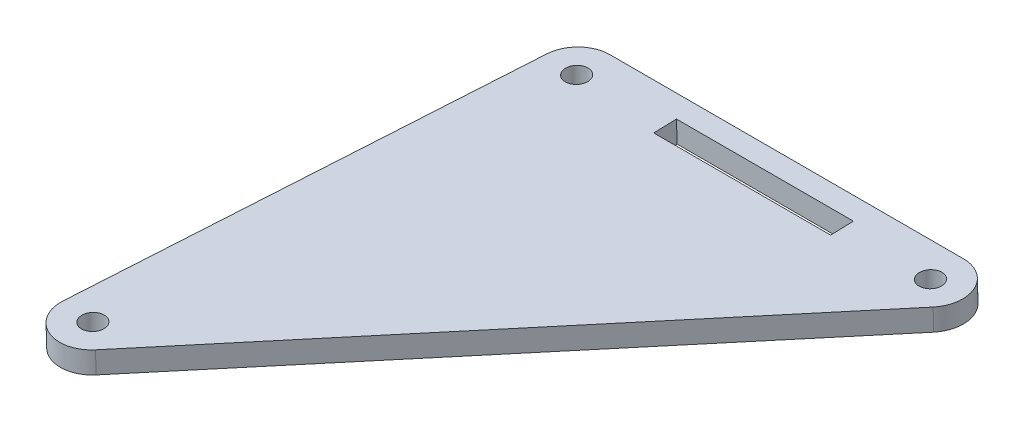
ISO-10303-21;
HEADER;
FILE_DESCRIPTION(('STEP AP214'),'2;1');
FILE_NAME('part.step','',(''),(''),'','','');
FILE_SCHEMA(('AUTOMOTIVE_DESIGN { 1 0 10303 214 1 1 1 1 }'));
ENDSEC;
DATA;
#1=APPLICATION_CONTEXT('core data for automotive mechanical design processes');
#2=APPLICATION_PROTOCOL_DEFINITION('international standard','automotive_design',2000,#1);
#3=PRODUCT_CONTEXT('',#1,'mechanical');
#4=PRODUCT('Part','Part','',(#3));
#5=PRODUCT_RELATED_PRODUCT_CATEGORY('part','',(#4));
#6=PRODUCT_DEFINITION_FORMATION('','',#4);
#7=PRODUCT_DEFINITION_CONTEXT('part definition',#1,'design');
#8=PRODUCT_DEFINITION('design','',#6,#7);
#9=PRODUCT_DEFINITION_SHAPE('','',#8);
#10=(LENGTH_UNIT() NAMED_UNIT(*) SI_UNIT(.MILLI.,.METRE.));
#11=(NAMED_UNIT(*) PLANE_ANGLE_UNIT() SI_UNIT($,.RADIAN.));
#12=(NAMED_UNIT(*) SI_UNIT($,.STERADIAN.) SOLID_ANGLE_UNIT());
#13=UNCERTAINTY_MEASURE_WITH_UNIT(LENGTH_MEASURE(1.E-05),#10,'distance_accuracy_value','');
#14=(GEOMETRIC_REPRESENTATION_CONTEXT(3) GLOBAL_UNCERTAINTY_ASSIGNED_CONTEXT((#13)) GLOBAL_UNIT_ASSIGNED_CONTEXT((#10,
#11,#12)) REPRESENTATION_CONTEXT('',''));
#15=CARTESIAN_POINT('',(0.,0.,0.));
#16=DIRECTION('',(0.,0.,1.));
#17=DIRECTION('',(1.,0.,0.));
#18=AXIS2_PLACEMENT_3D('',#15,#16,#17);
#19=CARTESIAN_POINT('',(-170.726579561146,368.882500273271,-539.625309413886));
#20=DIRECTION('',(0.,0.999518314669366,0.0310344750319807));
#21=DIRECTION('',(0.,-0.0310344750319807,0.999518314669366));
#22=AXIS2_PLACEMENT_3D('',#19,#20,#21);
#23=PLANE('',#22);
#24=DIRECTION('',(0.,-0.0310344750319856,0.999518314669366));
#25=VECTOR('',#24,1.);
#26=CARTESIAN_POINT('',(-246.926579561146,368.983793696328,-542.887637241135));
#27=LINE('',#26,#25);
#28=CARTESIAN_POINT('',(-246.926579561146,368.983793696328,-542.887637241135));
#29=VERTEX_POINT('',#28);
#30=CARTESIAN_POINT('',(-246.926579561146,368.781206850214,-536.362981586637));
#31=VERTEX_POINT('',#30);
#32=EDGE_CURVE('E54',#29,#31,#27,.T.);
#33=ORIENTED_EDGE('',*,*,#32,.F.);
#34=DIRECTION('',(-1.,0.,0.));
#35=VECTOR('',#34,1.);
#36=CARTESIAN_POINT('',(-246.926579561146,368.983793696328,-542.887637241135));
#37=LINE('',#36,#35);
#38=CARTESIAN_POINT('',(-196.126579561146,368.983793696328,-542.887637241135));
#39=VERTEX_POINT('',#38);
#40=EDGE_CURVE('E134',#39,#29,#37,.T.);
#41=ORIENTED_EDGE('',*,*,#40,.F.);
#42=DIRECTION('',(0.,0.0310344750319771,-0.999518314669366));
#43=VECTOR('',#42,1.);
#44=CARTESIAN_POINT('',(-196.126579561146,368.983793696328,-542.887637241135));
#45=LINE('',#44,#43);
#46=CARTESIAN_POINT('',(-196.126579561146,368.781206850214,-536.362981586637));
#47=VERTEX_POINT('',#46);
#48=EDGE_CURVE('E119',#47,#39,#45,.T.);
#49=ORIENTED_EDGE('',*,*,#48,.F.);
#50=DIRECTION('',(1.,0.,0.));
#51=VECTOR('',#50,1.);
#52=CARTESIAN_POINT('',(-246.926579561146,368.781206850214,-536.362981586637));
#53=LINE('',#52,#51);
#54=EDGE_CURVE('E128',#31,#47,#53,.T.);
#55=ORIENTED_EDGE('',*,*,#54,.F.);
#56=EDGE_LOOP('',(#33,#41,#49,#55));
#57=FACE_BOUND('',#56,.T.);
#58=CARTESIAN_POINT('',(-272.326579561146,368.882500273271,-539.625309413886));
#59=DIRECTION('',(0.,0.999518314669366,0.0310344750319807));
#60=DIRECTION('',(0.,-0.0310344750319807,0.999518314669366));
#61=AXIS2_PLACEMENT_3D('',#58,#59,#60);
#62=CIRCLE('',#61,3.26390000000002);
#63=CARTESIAN_POINT('',(-272.326579561146,368.781206850214,-536.362981586636));
#64=VERTEX_POINT('',#63);
#65=EDGE_CURVE('E150',#64,#64,#62,.T.);
#66=ORIENTED_EDGE('',*,*,#65,.F.);
#67=EDGE_LOOP('',(#66));
#68=FACE_BOUND('',#67,.T.);
#69=CARTESIAN_POINT('',(-170.726579561146,368.882500273271,-539.625309413886));
#70=DIRECTION('',(0.,0.999518314669366,0.0310344750319807));
#71=DIRECTION('',(0.,-0.0310344750319807,0.999518314669366));
#72=AXIS2_PLACEMENT_3D('',#69,#70,#71);
#73=CIRCLE('',#72,9.52500000000012);
#74=CARTESIAN_POINT('',(-163.625928120344,368.685470766927,-533.279637385656));
#75=VERTEX_POINT('',#74);
#76=CARTESIAN_POINT('',(-170.726579561146,369.17810364795,-549.145721361112));
#77=VERTEX_POINT('',#76);
#78=EDGE_CURVE('E162',#75,#77,#73,.T.);
#79=ORIENTED_EDGE('',*,*,#78,.T.);
#80=DIRECTION('',(-1.,0.,0.));
#81=VECTOR('',#80,1.);
#82=CARTESIAN_POINT('',(-170.726579561146,369.17810364795,-549.145721361112));
#83=LINE('',#82,#81);
#84=CARTESIAN_POINT('',(-272.326579561146,369.17810364795,-549.145721361112));
#85=VERTEX_POINT('',#84);
#86=EDGE_CURVE('E165',#77,#85,#83,.T.);
#87=ORIENTED_EDGE('',*,*,#86,.T.);
#88=CARTESIAN_POINT('',(-272.326579561146,368.882500273271,-539.625309413886));
#89=DIRECTION('',(0.,0.999518314669366,0.0310344750319807));
#90=DIRECTION('',(0.,-0.0310344750319807,0.999518314669366));
#91=AXIS2_PLACEMENT_3D('',#88,#89,#90);
#92=CIRCLE('',#91,9.52500000000012);
#93=CARTESIAN_POINT('',(-281.809681848106,368.91019575621,-540.517289780981));
#94=VERTEX_POINT('',#93);
#95=EDGE_CURVE('E168',#85,#94,#92,.T.);
#96=ORIENTED_EDGE('',*,*,#95,.T.);
#97=DIRECTION('',(-0.093691362520812,-0.0308979633753672,0.995121723432992));
#98=VECTOR('',#97,1.);
#99=CARTESIAN_POINT('',(-281.809681848106,368.91019575621,-540.517289780981));
#100=LINE('',#99,#98);
#101=CARTESIAN_POINT('',(-293.761055515477,364.968817427149,-413.578463817971));
#102=VERTEX_POINT('',#101);
#103=EDGE_CURVE('E170',#94,#102,#100,.T.);
#104=ORIENTED_EDGE('',*,*,#103,.T.);
#105=CARTESIAN_POINT('',(-284.277953228518,364.941121944209,-412.686483450876));
#106=DIRECTION('',(0.,0.999518314669366,0.0310344750319807));
#107=DIRECTION('',(0.,-0.0310344750319807,0.999518314669366));
#108=AXIS2_PLACEMENT_3D('',#105,#106,#107);
#109=CIRCLE('',#108,9.52500000000002);
#110=CARTESIAN_POINT('',(-277.177301787715,364.744092437865,-406.340811422646));
#111=VERTEX_POINT('',#110);
#112=EDGE_CURVE('E172',#102,#111,#109,.T.);
#113=ORIENTED_EDGE('',*,*,#112,.T.);
#114=DIRECTION('',(0.666533345763378,0.0231354320052892,-0.745116132405819));
#115=VECTOR('',#114,1.);
#116=CARTESIAN_POINT('',(-277.177301787715,364.744092437865,-406.340811422646));
#117=LINE('',#116,#115);
#118=EDGE_CURVE('E174',#111,#75,#117,.T.);
#119=ORIENTED_EDGE('',*,*,#118,.T.);
#120=EDGE_LOOP('',(#79,#87,#96,#104,#113,#119));
#121=FACE_BOUND('',#120,.T.);
#122=CARTESIAN_POINT('',(-284.277953228518,364.941121944209,-412.686483450876));
#123=DIRECTION('',(0.,0.999518314669366,0.0310344750319807));
#124=DIRECTION('',(0.,-0.0310344750319807,0.999518314669366));
#125=AXIS2_PLACEMENT_3D('',#122,#123,#124);
#126=CIRCLE('',#125,3.26390000000002);
#127=CARTESIAN_POINT('',(-284.277953228518,364.839828521152,-409.424155623627));
#128=VERTEX_POINT('',#127);
#129=EDGE_CURVE('E156',#128,#128,#126,.T.);
#130=ORIENTED_EDGE('',*,*,#129,.F.);
#131=EDGE_LOOP('',(#130));
#132=FACE_BOUND('',#131,.T.);
#133=CARTESIAN_POINT('',(-170.726579561146,368.882500273271,-539.625309413886));
#134=DIRECTION('',(0.,0.999518314669366,0.0310344750319807));
#135=DIRECTION('',(0.,-0.0310344750319807,0.999518314669366));
#136=AXIS2_PLACEMENT_3D('',#133,#134,#135);
#137=CIRCLE('',#136,3.26390000000002);
#138=CARTESIAN_POINT('',(-170.726579561146,368.781206850214,-536.362981586636));
#139=VERTEX_POINT('',#138);
#140=EDGE_CURVE('E144',#139,#139,#137,.T.);
#141=ORIENTED_EDGE('',*,*,#140,.F.);
#142=EDGE_LOOP('',(#141));
#143=FACE_BOUND('',#142,.T.);
#144=ADVANCED_FACE('F39',(#57,#68,#121,#132,#143),#23,.T.);
#145=CARTESIAN_POINT('',(-170.726579561146,362.53555897512,-539.822378330339));
#146=DIRECTION('',(0.,0.999518314669366,0.0310344750319807));
#147=DIRECTION('',(0.,-0.0310344750319807,0.999518314669366));
#148=AXIS2_PLACEMENT_3D('',#145,#146,#147);
#149=PLANE('',#148);
#150=DIRECTION('',(-1.,0.,0.));
#151=VECTOR('',#150,1.);
#152=CARTESIAN_POINT('',(-170.726579561146,362.636852398177,-543.084706157588));
#153=LINE('',#152,#151);
#154=CARTESIAN_POINT('',(-196.126579561146,362.636852398177,-543.084706157588));
#155=VERTEX_POINT('',#154);
#156=CARTESIAN_POINT('',(-246.926579561146,362.636852398177,-543.084706157588));
#157=VERTEX_POINT('',#156);
#158=EDGE_CURVE('E47',#155,#157,#153,.T.);
#159=ORIENTED_EDGE('',*,*,#158,.T.);
#160=DIRECTION('',(0.,-0.0310344750319807,0.999518314669366));
#161=VECTOR('',#160,1.);
#162=CARTESIAN_POINT('',(-246.926579561146,362.53555897512,-539.822378330339));
#163=LINE('',#162,#161);
#164=CARTESIAN_POINT('',(-246.926579561146,362.434265552063,-536.56005050309));
#165=VERTEX_POINT('',#164);
#166=EDGE_CURVE('E11',#157,#165,#163,.T.);
#167=ORIENTED_EDGE('',*,*,#166,.T.);
#168=DIRECTION('',(1.,0.,0.));
#169=VECTOR('',#168,1.);
#170=CARTESIAN_POINT('',(-170.726579561146,362.434265552063,-536.56005050309));
#171=LINE('',#170,#169);
#172=CARTESIAN_POINT('',(-196.126579561146,362.434265552063,-536.56005050309));
#173=VERTEX_POINT('',#172);
#174=EDGE_CURVE('E205',#165,#173,#171,.T.);
#175=ORIENTED_EDGE('',*,*,#174,.T.);
#176=DIRECTION('',(0.,0.0310344750319807,-0.999518314669366));
#177=VECTOR('',#176,1.);
#178=CARTESIAN_POINT('',(-196.126579561146,362.53555897512,-539.822378330339));
#179=LINE('',#178,#177);
#180=EDGE_CURVE('E122',#173,#155,#179,.T.);
#181=ORIENTED_EDGE('',*,*,#180,.T.);
#182=EDGE_LOOP('',(#159,#167,#175,#181));
#183=FACE_BOUND('',#182,.T.);
#184=CARTESIAN_POINT('',(-170.726579561146,362.53555897512,-539.822378330339));
#185=DIRECTION('',(0.,0.999518314669366,0.0310344750319807));
#186=DIRECTION('',(0.,-0.0310344750319807,0.999518314669366));
#187=AXIS2_PLACEMENT_3D('',#184,#185,#186);
#188=CIRCLE('',#187,9.52500000000012);
#189=CARTESIAN_POINT('',(-163.625928120344,362.338529468776,-533.476706302109));
#190=VERTEX_POINT('',#189);
#191=CARTESIAN_POINT('',(-170.726579561146,362.8311623498,-549.342790277565));
#192=VERTEX_POINT('',#191);
#193=EDGE_CURVE('E159',#190,#192,#188,.T.);
#194=ORIENTED_EDGE('',*,*,#193,.F.);
#195=DIRECTION('',(0.666533345763378,0.0231354320052892,-0.745116132405819));
#196=VECTOR('',#195,1.);
#197=CARTESIAN_POINT('',(-277.177301787715,358.397151139715,-406.537880339099));
#198=LINE('',#197,#196);
#199=CARTESIAN_POINT('',(-277.177301787715,358.397151139715,-406.537880339099));
#200=VERTEX_POINT('',#199);
#201=EDGE_CURVE('E166',#200,#190,#198,.T.);
#202=ORIENTED_EDGE('',*,*,#201,.F.);
#203=CARTESIAN_POINT('',(-284.277953228518,358.594180646059,-412.883552367329));
#204=DIRECTION('',(0.,0.999518314669366,0.0310344750319807));
#205=DIRECTION('',(0.,-0.0310344750319807,0.999518314669366));
#206=AXIS2_PLACEMENT_3D('',#203,#204,#205);
#207=CIRCLE('',#206,9.52500000000002);
#208=CARTESIAN_POINT('',(-293.761055515477,358.621876128998,-413.775532734424));
#209=VERTEX_POINT('',#208);
#210=EDGE_CURVE('E185',#209,#200,#207,.T.);
#211=ORIENTED_EDGE('',*,*,#210,.F.);
#212=DIRECTION('',(-0.093691362520812,-0.0308979633753672,0.995121723432992));
#213=VECTOR('',#212,1.);
#214=CARTESIAN_POINT('',(-281.809681848106,362.56325445806,-540.714358697434));
#215=LINE('',#214,#213);
#216=CARTESIAN_POINT('',(-281.809681848106,362.56325445806,-540.714358697434));
#217=VERTEX_POINT('',#216);
#218=EDGE_CURVE('E183',#217,#209,#215,.T.);
#219=ORIENTED_EDGE('',*,*,#218,.F.);
#220=CARTESIAN_POINT('',(-272.326579561146,362.53555897512,-539.822378330339));
#221=DIRECTION('',(0.,0.999518314669366,0.0310344750319807));
#222=DIRECTION('',(0.,-0.0310344750319807,0.999518314669366));
#223=AXIS2_PLACEMENT_3D('',#220,#221,#222);
#224=CIRCLE('',#223,9.52500000000012);
#225=CARTESIAN_POINT('',(-272.326579561146,362.8311623498,-549.342790277565));
#226=VERTEX_POINT('',#225);
#227=EDGE_CURVE('E181',#226,#217,#224,.T.);
#228=ORIENTED_EDGE('',*,*,#227,.F.);
#229=DIRECTION('',(-1.,0.,0.));
#230=VECTOR('',#229,1.);
#231=CARTESIAN_POINT('',(-170.726579561146,362.8311623498,-549.342790277565));
#232=LINE('',#231,#230);
#233=EDGE_CURVE('E179',#192,#226,#232,.T.);
#234=ORIENTED_EDGE('',*,*,#233,.F.);
#235=EDGE_LOOP('',(#194,#202,#211,#219,#228,#234));
#236=FACE_BOUND('',#235,.T.);
#237=CARTESIAN_POINT('',(-284.277953228518,358.594180646059,-412.883552367329));
#238=DIRECTION('',(0.,0.999518314669366,0.0310344750319807));
#239=DIRECTION('',(0.,-0.0310344750319807,0.999518314669366));
#240=AXIS2_PLACEMENT_3D('',#237,#238,#239);
#241=CIRCLE('',#240,3.26390000000002);
#242=CARTESIAN_POINT('',(-284.277953228518,358.492887223002,-409.62122454008));
#243=VERTEX_POINT('',#242);
#244=EDGE_CURVE('E153',#243,#243,#241,.T.);
#245=ORIENTED_EDGE('',*,*,#244,.T.);
#246=EDGE_LOOP('',(#245));
#247=FACE_BOUND('',#246,.T.);
#248=CARTESIAN_POINT('',(-272.326579561146,362.53555897512,-539.822378330339));
#249=DIRECTION('',(0.,0.999518314669366,0.0310344750319807));
#250=DIRECTION('',(0.,-0.0310344750319807,0.999518314669366));
#251=AXIS2_PLACEMENT_3D('',#248,#249,#250);
#252=CIRCLE('',#251,3.26390000000002);
#253=CARTESIAN_POINT('',(-272.326579561146,362.434265552063,-536.56005050309));
#254=VERTEX_POINT('',#253);
#255=EDGE_CURVE('E147',#254,#254,#252,.T.);
#256=ORIENTED_EDGE('',*,*,#255,.T.);
#257=EDGE_LOOP('',(#256));
#258=FACE_BOUND('',#257,.T.);
#259=CARTESIAN_POINT('',(-170.726579561146,362.53555897512,-539.822378330339));
#260=DIRECTION('',(0.,0.999518314669366,0.0310344750319807));
#261=DIRECTION('',(0.,-0.0310344750319807,0.999518314669366));
#262=AXIS2_PLACEMENT_3D('',#259,#260,#261);
#263=CIRCLE('',#262,3.26390000000002);
#264=CARTESIAN_POINT('',(-170.726579561146,362.434265552063,-536.560050503089));
#265=VERTEX_POINT('',#264);
#266=EDGE_CURVE('E141',#265,#265,#263,.T.);
#267=ORIENTED_EDGE('',*,*,#266,.T.);
#268=EDGE_LOOP('',(#267));
#269=FACE_BOUND('',#268,.T.);
#270=ADVANCED_FACE('F209',(#183,#236,#247,#258,#269),#149,.F.);
#271=CARTESIAN_POINT('',(-170.726579561146,368.882500273271,-539.625309413886));
#272=DIRECTION('',(0.,-0.999518314669366,-0.0310344750319807));
#273=DIRECTION('',(0.,0.0310344750319807,-0.999518314669366));
#274=AXIS2_PLACEMENT_3D('',#271,#272,#273);
#275=CYLINDRICAL_SURFACE('',#274,9.52500000000012);
#276=ORIENTED_EDGE('',*,*,#193,.T.);
#277=DIRECTION('',(0.,-0.999518314669366,-0.0310344750319807));
#278=VECTOR('',#277,1.);
#279=CARTESIAN_POINT('',(-170.726579561146,369.17810364795,-549.145721361112));
#280=LINE('',#279,#278);
#281=EDGE_CURVE('E202',#77,#192,#280,.T.);
#282=ORIENTED_EDGE('',*,*,#281,.F.);
#283=ORIENTED_EDGE('',*,*,#78,.F.);
#284=DIRECTION('',(0.,-0.999518314669366,-0.0310344750319807));
#285=VECTOR('',#284,1.);
#286=CARTESIAN_POINT('',(-163.625928120344,368.685470766927,-533.279637385656));
#287=LINE('',#286,#285);
#288=EDGE_CURVE('E176',#75,#190,#287,.T.);
#289=ORIENTED_EDGE('',*,*,#288,.T.);
#290=EDGE_LOOP('',(#276,#282,#283,#289));
#291=FACE_BOUND('',#290,.T.);
#292=ADVANCED_FACE('F41',(#291),#275,.T.);
#293=CARTESIAN_POINT('',(-170.726579561146,369.17810364795,-549.145721361112));
#294=DIRECTION('',(0.,-0.0310344750319807,0.999518314669366));
#295=DIRECTION('',(0.,-0.999518314669366,-0.0310344750319807));
#296=AXIS2_PLACEMENT_3D('',#293,#294,#295);
#297=PLANE('',#296);
#298=ORIENTED_EDGE('',*,*,#233,.T.);
#299=DIRECTION('',(0.,-0.999518314669366,-0.0310344750319807));
#300=VECTOR('',#299,1.);
#301=CARTESIAN_POINT('',(-272.326579561146,369.17810364795,-549.145721361112));
#302=LINE('',#301,#300);
#303=EDGE_CURVE('E199',#85,#226,#302,.T.);
#304=ORIENTED_EDGE('',*,*,#303,.F.);
#305=ORIENTED_EDGE('',*,*,#86,.F.);
#306=ORIENTED_EDGE('',*,*,#281,.T.);
#307=EDGE_LOOP('',(#298,#304,#305,#306));
#308=FACE_BOUND('',#307,.T.);
#309=ADVANCED_FACE('F251',(#308),#297,.F.);
#310=CARTESIAN_POINT('',(-272.326579561146,368.882500273271,-539.625309413886));
#311=DIRECTION('',(0.,-0.999518314669366,-0.0310344750319807));
#312=DIRECTION('',(0.,0.0310344750319807,-0.999518314669366));
#313=AXIS2_PLACEMENT_3D('',#310,#311,#312);
#314=CYLINDRICAL_SURFACE('',#313,9.52500000000012);
#315=ORIENTED_EDGE('',*,*,#227,.T.);
#316=DIRECTION('',(0.,-0.999518314669366,-0.0310344750319807));
#317=VECTOR('',#316,1.);
#318=CARTESIAN_POINT('',(-281.809681848106,368.91019575621,-540.517289780981));
#319=LINE('',#318,#317);
#320=EDGE_CURVE('E196',#94,#217,#319,.T.);
#321=ORIENTED_EDGE('',*,*,#320,.F.);
#322=ORIENTED_EDGE('',*,*,#95,.F.);
#323=ORIENTED_EDGE('',*,*,#303,.T.);
#324=EDGE_LOOP('',(#315,#321,#322,#323));
#325=FACE_BOUND('',#324,.T.);
#326=ADVANCED_FACE('F248',(#325),#314,.T.);
#327=CARTESIAN_POINT('',(-281.809681848106,368.91019575621,-540.517289780981));
#328=DIRECTION('',(0.995601289969531,-0.00290766225086454,0.0936462327658786));
#329=DIRECTION('',(0.0936466286344153,0.,-0.995605498651654));
#330=AXIS2_PLACEMENT_3D('',#327,#328,#329);
#331=PLANE('',#330);
#332=ORIENTED_EDGE('',*,*,#218,.T.);
#333=DIRECTION('',(0.,-0.999518314669366,-0.0310344750319807));
#334=VECTOR('',#333,1.);
#335=CARTESIAN_POINT('',(-293.761055515477,364.968817427149,-413.578463817971));
#336=LINE('',#335,#334);
#337=EDGE_CURVE('E193',#102,#209,#336,.T.);
#338=ORIENTED_EDGE('',*,*,#337,.F.);
#339=ORIENTED_EDGE('',*,*,#103,.F.);
#340=ORIENTED_EDGE('',*,*,#320,.T.);
#341=EDGE_LOOP('',(#332,#338,#339,#340));
#342=FACE_BOUND('',#341,.T.);
#343=ADVANCED_FACE('F244',(#342),#331,.F.);
#344=CARTESIAN_POINT('',(-284.277953228518,364.941121944209,-412.686483450876));
#345=DIRECTION('',(0.,-0.999518314669366,-0.0310344750319807));
#346=DIRECTION('',(0.,0.0310344750319807,-0.999518314669366));
#347=AXIS2_PLACEMENT_3D('',#344,#345,#346);
#348=CYLINDRICAL_SURFACE('',#347,9.52500000000002);
#349=ORIENTED_EDGE('',*,*,#210,.T.);
#350=DIRECTION('',(0.,-0.999518314669366,-0.0310344750319807));
#351=VECTOR('',#350,1.);
#352=CARTESIAN_POINT('',(-277.177301787715,364.744092437865,-406.340811422646));
#353=LINE('',#352,#351);
#354=EDGE_CURVE('E190',#111,#200,#353,.T.);
#355=ORIENTED_EDGE('',*,*,#354,.F.);
#356=ORIENTED_EDGE('',*,*,#112,.F.);
#357=ORIENTED_EDGE('',*,*,#337,.T.);
#358=EDGE_LOOP('',(#349,#355,#356,#357));
#359=FACE_BOUND('',#358,.T.);
#360=ADVANCED_FACE('F240',(#359),#348,.T.);
#361=CARTESIAN_POINT('',(-277.177301787715,364.744092437865,-406.340811422646));
#362=DIRECTION('',(-0.745475216882142,0.0206855124770762,-0.666212286428345));
#363=DIRECTION('',(-0.666354865115688,0.,0.745634758938083));
#364=AXIS2_PLACEMENT_3D('',#361,#362,#363);
#365=PLANE('',#364);
#366=ORIENTED_EDGE('',*,*,#201,.T.);
#367=ORIENTED_EDGE('',*,*,#288,.F.);
#368=ORIENTED_EDGE('',*,*,#118,.F.);
#369=ORIENTED_EDGE('',*,*,#354,.T.);
#370=EDGE_LOOP('',(#366,#367,#368,#369));
#371=FACE_BOUND('',#370,.T.);
#372=ADVANCED_FACE('F237',(#371),#365,.F.);
#373=CARTESIAN_POINT('',(-284.277953228518,364.941121944209,-412.686483450876));
#374=DIRECTION('',(0.,-0.999518314669366,-0.0310344750319807));
#375=DIRECTION('',(0.,0.0310344750319807,-0.999518314669366));
#376=AXIS2_PLACEMENT_3D('',#373,#374,#375);
#377=CYLINDRICAL_SURFACE('',#376,3.26390000000002);
#378=ORIENTED_EDGE('',*,*,#129,.T.);
#379=EDGE_LOOP('',(#378));
#380=FACE_BOUND('',#379,.T.);
#381=ORIENTED_EDGE('',*,*,#244,.F.);
#382=EDGE_LOOP('',(#381));
#383=FACE_BOUND('',#382,.T.);
#384=ADVANCED_FACE('F234',(#380,#383),#377,.F.);
#385=CARTESIAN_POINT('',(-272.326579561146,368.882500273271,-539.625309413886));
#386=DIRECTION('',(0.,-0.999518314669366,-0.0310344750319807));
#387=DIRECTION('',(0.,0.0310344750319807,-0.999518314669366));
#388=AXIS2_PLACEMENT_3D('',#385,#386,#387);
#389=CYLINDRICAL_SURFACE('',#388,3.26390000000002);
#390=ORIENTED_EDGE('',*,*,#65,.T.);
#391=EDGE_LOOP('',(#390));
#392=FACE_BOUND('',#391,.T.);
#393=ORIENTED_EDGE('',*,*,#255,.F.);
#394=EDGE_LOOP('',(#393));
#395=FACE_BOUND('',#394,.T.);
#396=ADVANCED_FACE('F224',(#392,#395),#389,.F.);
#397=CARTESIAN_POINT('',(-170.726579561146,368.882500273271,-539.625309413886));
#398=DIRECTION('',(0.,-0.999518314669366,-0.0310344750319807));
#399=DIRECTION('',(0.,0.0310344750319807,-0.999518314669366));
#400=AXIS2_PLACEMENT_3D('',#397,#398,#399);
#401=CYLINDRICAL_SURFACE('',#400,3.26390000000002);
#402=ORIENTED_EDGE('',*,*,#140,.T.);
#403=EDGE_LOOP('',(#402));
#404=FACE_BOUND('',#403,.T.);
#405=ORIENTED_EDGE('',*,*,#266,.F.);
#406=EDGE_LOOP('',(#405));
#407=FACE_BOUND('',#406,.T.);
#408=ADVANCED_FACE('F216',(#404,#407),#401,.F.);
#409=CARTESIAN_POINT('',(-246.926579561146,358.108632827587,-543.225304799094));
#410=DIRECTION('',(-1.,0.,0.));
#411=DIRECTION('',(0.,-1.,0.));
#412=AXIS2_PLACEMENT_3D('',#409,#410,#411);
#413=PLANE('',#412);
#414=DIRECTION('',(0.,0.999518314669366,0.0310344750319807));
#415=VECTOR('',#414,1.);
#416=CARTESIAN_POINT('',(-246.926579561146,358.108632827587,-543.225304799094));
#417=LINE('',#416,#415);
#418=EDGE_CURVE('E139',#157,#29,#417,.T.);
#419=ORIENTED_EDGE('',*,*,#418,.T.);
#420=ORIENTED_EDGE('',*,*,#32,.T.);
#421=DIRECTION('',(0.,0.999518314669366,0.0310344750319807));
#422=VECTOR('',#421,1.);
#423=CARTESIAN_POINT('',(-246.926579561146,357.906045981473,-536.700649144596));
#424=LINE('',#423,#422);
#425=EDGE_CURVE('E125',#165,#31,#424,.T.);
#426=ORIENTED_EDGE('',*,*,#425,.F.);
#427=ORIENTED_EDGE('',*,*,#166,.F.);
#428=EDGE_LOOP('',(#419,#420,#426,#427));
#429=FACE_BOUND('',#428,.T.);
#430=ADVANCED_FACE('F214',(#429),#413,.F.);
#431=CARTESIAN_POINT('',(-246.926579561146,358.108632827587,-543.225304799094));
#432=DIRECTION('',(0.,0.0310344750319807,-0.999518314669366));
#433=DIRECTION('',(0.,0.999518314669366,0.0310344750319807));
#434=AXIS2_PLACEMENT_3D('',#431,#432,#433);
#435=PLANE('',#434);
#436=DIRECTION('',(0.,0.999518314669366,0.0310344750319807));
#437=VECTOR('',#436,1.);
#438=CARTESIAN_POINT('',(-196.126579561146,358.108632827587,-543.225304799094));
#439=LINE('',#438,#437);
#440=EDGE_CURVE('E124',#155,#39,#439,.T.);
#441=ORIENTED_EDGE('',*,*,#440,.T.);
#442=ORIENTED_EDGE('',*,*,#40,.T.);
#443=ORIENTED_EDGE('',*,*,#418,.F.);
#444=ORIENTED_EDGE('',*,*,#158,.F.);
#445=EDGE_LOOP('',(#441,#442,#443,#444));
#446=FACE_BOUND('',#445,.T.);
#447=ADVANCED_FACE('F213',(#446),#435,.F.);
#448=CARTESIAN_POINT('',(-196.126579561146,358.108632827587,-543.225304799094));
#449=DIRECTION('',(1.,0.,0.));
#450=DIRECTION('',(0.,1.,0.));
#451=AXIS2_PLACEMENT_3D('',#448,#449,#450);
#452=PLANE('',#451);
#453=DIRECTION('',(0.,0.999518314669366,0.0310344750319807));
#454=VECTOR('',#453,1.);
#455=CARTESIAN_POINT('',(-196.126579561146,357.906045981473,-536.700649144596));
#456=LINE('',#455,#454);
#457=EDGE_CURVE('E62',#173,#47,#456,.T.);
#458=ORIENTED_EDGE('',*,*,#457,.T.);
#459=ORIENTED_EDGE('',*,*,#48,.T.);
#460=ORIENTED_EDGE('',*,*,#440,.F.);
#461=ORIENTED_EDGE('',*,*,#180,.F.);
#462=EDGE_LOOP('',(#458,#459,#460,#461));
#463=FACE_BOUND('',#462,.T.);
#464=ADVANCED_FACE('F116',(#463),#452,.F.);
#465=CARTESIAN_POINT('',(-246.926579561146,357.906045981473,-536.700649144596));
#466=DIRECTION('',(0.,-0.0310344750319807,0.999518314669366));
#467=DIRECTION('',(0.,-0.999518314669366,-0.0310344750319807));
#468=AXIS2_PLACEMENT_3D('',#465,#466,#467);
#469=PLANE('',#468);
#470=ORIENTED_EDGE('',*,*,#425,.T.);
#471=ORIENTED_EDGE('',*,*,#54,.T.);
#472=ORIENTED_EDGE('',*,*,#457,.F.);
#473=ORIENTED_EDGE('',*,*,#174,.F.);
#474=EDGE_LOOP('',(#470,#471,#472,#473));
#475=FACE_BOUND('',#474,.T.);
#476=ADVANCED_FACE('F129',(#475),#469,.F.);
#477=CLOSED_SHELL('',(#144,#270,#292,#309,#326,#343,#360,#372,#384,#396,#408,#430,#447,#464,#476));
#478=MANIFOLD_SOLID_BREP('B2',#477);
#479=ADVANCED_BREP_SHAPE_REPRESENTATION('',(#18,#478),#14);
#480=SHAPE_DEFINITION_REPRESENTATION(#9,#479);
ENDSEC;
END-ISO-10303-21;
